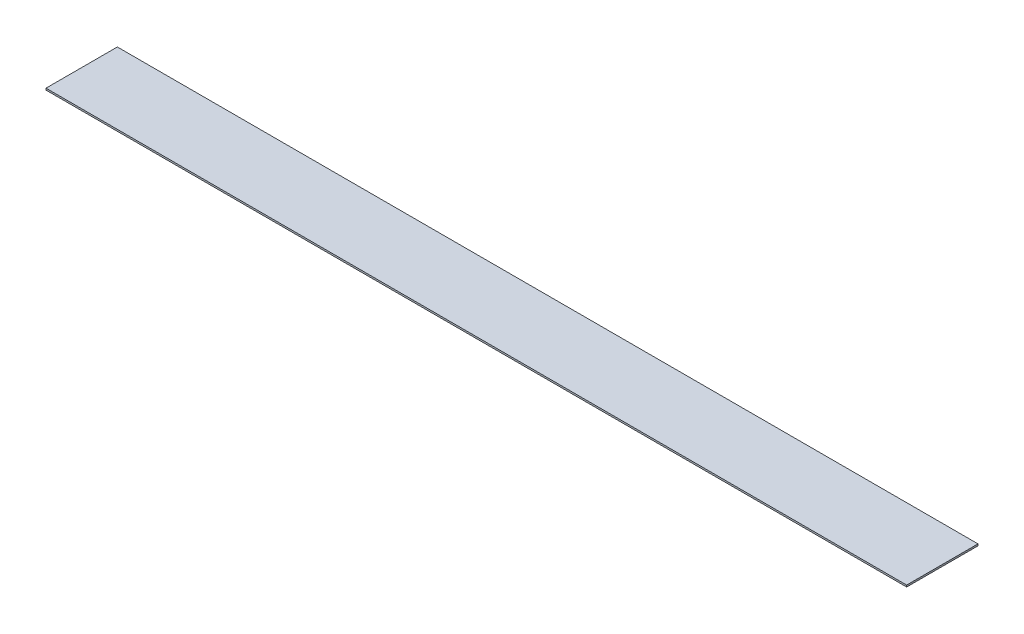
ISO-10303-21;
HEADER;
FILE_DESCRIPTION(('STEP AP214'),'2;1');
FILE_NAME('part.step','',(''),(''),'','','');
FILE_SCHEMA(('AUTOMOTIVE_DESIGN { 1 0 10303 214 1 1 1 1 }'));
ENDSEC;
DATA;
#1=APPLICATION_CONTEXT('core data for automotive mechanical design processes');
#2=APPLICATION_PROTOCOL_DEFINITION('international standard','automotive_design',2000,#1);
#3=PRODUCT_CONTEXT('',#1,'mechanical');
#4=PRODUCT('Part','Part','',(#3));
#5=PRODUCT_RELATED_PRODUCT_CATEGORY('part','',(#4));
#6=PRODUCT_DEFINITION_FORMATION('','',#4);
#7=PRODUCT_DEFINITION_CONTEXT('part definition',#1,'design');
#8=PRODUCT_DEFINITION('design','',#6,#7);
#9=PRODUCT_DEFINITION_SHAPE('','',#8);
#10=(LENGTH_UNIT() NAMED_UNIT(*) SI_UNIT(.MILLI.,.METRE.));
#11=(NAMED_UNIT(*) PLANE_ANGLE_UNIT() SI_UNIT($,.RADIAN.));
#12=(NAMED_UNIT(*) SI_UNIT($,.STERADIAN.) SOLID_ANGLE_UNIT());
#13=UNCERTAINTY_MEASURE_WITH_UNIT(LENGTH_MEASURE(1.E-05),#10,'distance_accuracy_value','');
#14=(GEOMETRIC_REPRESENTATION_CONTEXT(3) GLOBAL_UNCERTAINTY_ASSIGNED_CONTEXT((#13)) GLOBAL_UNIT_ASSIGNED_CONTEXT((#10,
#11,#12)) REPRESENTATION_CONTEXT('',''));
#15=CARTESIAN_POINT('',(0.,0.,0.));
#16=DIRECTION('',(0.,0.,1.));
#17=DIRECTION('',(1.,0.,0.));
#18=AXIS2_PLACEMENT_3D('',#15,#16,#17);
#19=CARTESIAN_POINT('',(249.86,1.,-20.71));
#20=DIRECTION('',(-1.,0.,0.));
#21=DIRECTION('',(0.,0.,1.));
#22=AXIS2_PLACEMENT_3D('',#19,#20,#21);
#23=PLANE('',#22);
#24=DIRECTION('',(0.,0.,-1.));
#25=VECTOR('',#24,1.);
#26=CARTESIAN_POINT('',(249.86,0.,-20.71));
#27=LINE('',#26,#25);
#28=CARTESIAN_POINT('',(249.86,0.,20.71));
#29=VERTEX_POINT('',#28);
#30=CARTESIAN_POINT('',(249.86,0.,-20.71));
#31=VERTEX_POINT('',#30);
#32=EDGE_CURVE('E108',#29,#31,#27,.T.);
#33=ORIENTED_EDGE('',*,*,#32,.T.);
#34=DIRECTION('',(0.,-1.,0.));
#35=VECTOR('',#34,1.);
#36=CARTESIAN_POINT('',(249.86,1.,-20.71));
#37=LINE('',#36,#35);
#38=CARTESIAN_POINT('',(249.86,1.,-20.71));
#39=VERTEX_POINT('',#38);
#40=EDGE_CURVE('E11',#39,#31,#37,.T.);
#41=ORIENTED_EDGE('',*,*,#40,.F.);
#42=DIRECTION('',(0.,0.,-1.));
#43=VECTOR('',#42,1.);
#44=CARTESIAN_POINT('',(249.86,1.,-20.71));
#45=LINE('',#44,#43);
#46=CARTESIAN_POINT('',(249.86,1.,20.71));
#47=VERTEX_POINT('',#46);
#48=EDGE_CURVE('E91',#47,#39,#45,.T.);
#49=ORIENTED_EDGE('',*,*,#48,.F.);
#50=DIRECTION('',(0.,-1.,0.));
#51=VECTOR('',#50,1.);
#52=CARTESIAN_POINT('',(249.86,1.,20.71));
#53=LINE('',#52,#51);
#54=EDGE_CURVE('E104',#47,#29,#53,.T.);
#55=ORIENTED_EDGE('',*,*,#54,.T.);
#56=EDGE_LOOP('',(#33,#41,#49,#55));
#57=FACE_BOUND('',#56,.T.);
#58=ADVANCED_FACE('F39',(#57),#23,.F.);
#59=CARTESIAN_POINT('',(-249.86,1.,-20.71));
#60=DIRECTION('',(0.,0.,1.));
#61=DIRECTION('',(1.,0.,0.));
#62=AXIS2_PLACEMENT_3D('',#59,#60,#61);
#63=PLANE('',#62);
#64=DIRECTION('',(-1.,0.,0.));
#65=VECTOR('',#64,1.);
#66=CARTESIAN_POINT('',(-249.86,0.,-20.71));
#67=LINE('',#66,#65);
#68=CARTESIAN_POINT('',(-249.86,0.,-20.71));
#69=VERTEX_POINT('',#68);
#70=EDGE_CURVE('E96',#31,#69,#67,.T.);
#71=ORIENTED_EDGE('',*,*,#70,.T.);
#72=DIRECTION('',(0.,-1.,0.));
#73=VECTOR('',#72,1.);
#74=CARTESIAN_POINT('',(-249.86,1.,-20.71));
#75=LINE('',#74,#73);
#76=CARTESIAN_POINT('',(-249.86,1.,-20.71));
#77=VERTEX_POINT('',#76);
#78=EDGE_CURVE('E48',#77,#69,#75,.T.);
#79=ORIENTED_EDGE('',*,*,#78,.F.);
#80=DIRECTION('',(-1.,0.,0.));
#81=VECTOR('',#80,1.);
#82=CARTESIAN_POINT('',(-249.86,1.,-20.71));
#83=LINE('',#82,#81);
#84=EDGE_CURVE('E86',#39,#77,#83,.T.);
#85=ORIENTED_EDGE('',*,*,#84,.F.);
#86=ORIENTED_EDGE('',*,*,#40,.T.);
#87=EDGE_LOOP('',(#71,#79,#85,#86));
#88=FACE_BOUND('',#87,.T.);
#89=ADVANCED_FACE('F95',(#88),#63,.F.);
#90=CARTESIAN_POINT('',(-249.86,1.,-20.71));
#91=DIRECTION('',(1.,0.,0.));
#92=DIRECTION('',(0.,0.,-1.));
#93=AXIS2_PLACEMENT_3D('',#90,#91,#92);
#94=PLANE('',#93);
#95=DIRECTION('',(0.,0.,1.));
#96=VECTOR('',#95,1.);
#97=CARTESIAN_POINT('',(-249.86,0.,-20.71));
#98=LINE('',#97,#96);
#99=CARTESIAN_POINT('',(-249.86,0.,20.71));
#100=VERTEX_POINT('',#99);
#101=EDGE_CURVE('E73',#69,#100,#98,.T.);
#102=ORIENTED_EDGE('',*,*,#101,.T.);
#103=DIRECTION('',(0.,-1.,0.));
#104=VECTOR('',#103,1.);
#105=CARTESIAN_POINT('',(-249.86,1.,20.71));
#106=LINE('',#105,#104);
#107=CARTESIAN_POINT('',(-249.86,1.,20.71));
#108=VERTEX_POINT('',#107);
#109=EDGE_CURVE('E98',#108,#100,#106,.T.);
#110=ORIENTED_EDGE('',*,*,#109,.F.);
#111=DIRECTION('',(0.,0.,1.));
#112=VECTOR('',#111,1.);
#113=CARTESIAN_POINT('',(-249.86,1.,-20.71));
#114=LINE('',#113,#112);
#115=EDGE_CURVE('E89',#77,#108,#114,.T.);
#116=ORIENTED_EDGE('',*,*,#115,.F.);
#117=ORIENTED_EDGE('',*,*,#78,.T.);
#118=EDGE_LOOP('',(#102,#110,#116,#117));
#119=FACE_BOUND('',#118,.T.);
#120=ADVANCED_FACE('F99',(#119),#94,.F.);
#121=CARTESIAN_POINT('',(-249.86,1.,20.71));
#122=DIRECTION('',(0.,0.,-1.));
#123=DIRECTION('',(-1.,0.,0.));
#124=AXIS2_PLACEMENT_3D('',#121,#122,#123);
#125=PLANE('',#124);
#126=DIRECTION('',(1.,0.,0.));
#127=VECTOR('',#126,1.);
#128=CARTESIAN_POINT('',(-249.86,0.,20.71));
#129=LINE('',#128,#127);
#130=EDGE_CURVE('E79',#100,#29,#129,.T.);
#131=ORIENTED_EDGE('',*,*,#130,.T.);
#132=ORIENTED_EDGE('',*,*,#54,.F.);
#133=DIRECTION('',(1.,0.,0.));
#134=VECTOR('',#133,1.);
#135=CARTESIAN_POINT('',(-249.86,1.,20.71));
#136=LINE('',#135,#134);
#137=EDGE_CURVE('E56',#108,#47,#136,.T.);
#138=ORIENTED_EDGE('',*,*,#137,.F.);
#139=ORIENTED_EDGE('',*,*,#109,.T.);
#140=EDGE_LOOP('',(#131,#132,#138,#139));
#141=FACE_BOUND('',#140,.T.);
#142=ADVANCED_FACE('F122',(#141),#125,.F.);
#143=CARTESIAN_POINT('',(0.,1.,0.));
#144=DIRECTION('',(0.,1.,0.));
#145=DIRECTION('',(0.,0.,1.));
#146=AXIS2_PLACEMENT_3D('',#143,#144,#145);
#147=PLANE('',#146);
#148=ORIENTED_EDGE('',*,*,#48,.T.);
#149=ORIENTED_EDGE('',*,*,#84,.T.);
#150=ORIENTED_EDGE('',*,*,#115,.T.);
#151=ORIENTED_EDGE('',*,*,#137,.T.);
#152=EDGE_LOOP('',(#148,#149,#150,#151));
#153=FACE_BOUND('',#152,.T.);
#154=ADVANCED_FACE('F87',(#153),#147,.T.);
#155=CARTESIAN_POINT('',(0.,0.,0.));
#156=DIRECTION('',(0.,1.,0.));
#157=DIRECTION('',(0.,0.,1.));
#158=AXIS2_PLACEMENT_3D('',#155,#156,#157);
#159=PLANE('',#158);
#160=ORIENTED_EDGE('',*,*,#32,.F.);
#161=ORIENTED_EDGE('',*,*,#130,.F.);
#162=ORIENTED_EDGE('',*,*,#101,.F.);
#163=ORIENTED_EDGE('',*,*,#70,.F.);
#164=EDGE_LOOP('',(#160,#161,#162,#163));
#165=FACE_BOUND('',#164,.T.);
#166=ADVANCED_FACE('F125',(#165),#159,.F.);
#167=CLOSED_SHELL('',(#58,#89,#120,#142,#154,#166));
#168=MANIFOLD_SOLID_BREP('B2',#167);
#169=ADVANCED_BREP_SHAPE_REPRESENTATION('',(#18,#168),#14);
#170=SHAPE_DEFINITION_REPRESENTATION(#9,#169);
ENDSEC;
END-ISO-10303-21;
